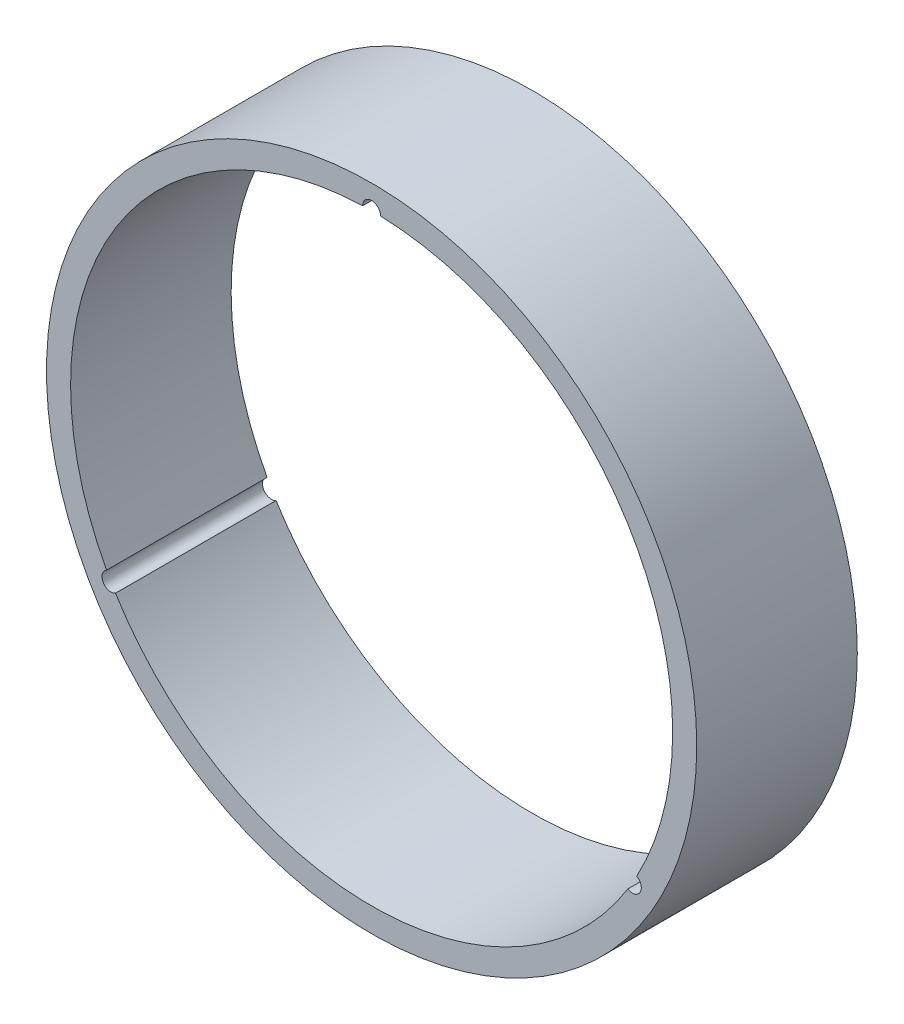
ISO-10303-21;
HEADER;
FILE_DESCRIPTION(('STEP AP214'),'2;1');
FILE_NAME('part.step','',(''),(''),'','','');
FILE_SCHEMA(('AUTOMOTIVE_DESIGN { 1 0 10303 214 1 1 1 1 }'));
ENDSEC;
DATA;
#1=APPLICATION_CONTEXT('core data for automotive mechanical design processes');
#2=APPLICATION_PROTOCOL_DEFINITION('international standard','automotive_design',2000,#1);
#3=PRODUCT_CONTEXT('',#1,'mechanical');
#4=PRODUCT('Part','Part','',(#3));
#5=PRODUCT_RELATED_PRODUCT_CATEGORY('part','',(#4));
#6=PRODUCT_DEFINITION_FORMATION('','',#4);
#7=PRODUCT_DEFINITION_CONTEXT('part definition',#1,'design');
#8=PRODUCT_DEFINITION('design','',#6,#7);
#9=PRODUCT_DEFINITION_SHAPE('','',#8);
#10=(LENGTH_UNIT() NAMED_UNIT(*) SI_UNIT(.MILLI.,.METRE.));
#11=(NAMED_UNIT(*) PLANE_ANGLE_UNIT() SI_UNIT($,.RADIAN.));
#12=(NAMED_UNIT(*) SI_UNIT($,.STERADIAN.) SOLID_ANGLE_UNIT());
#13=UNCERTAINTY_MEASURE_WITH_UNIT(LENGTH_MEASURE(1.E-05),#10,'distance_accuracy_value','');
#14=(GEOMETRIC_REPRESENTATION_CONTEXT(3) GLOBAL_UNCERTAINTY_ASSIGNED_CONTEXT((#13)) GLOBAL_UNIT_ASSIGNED_CONTEXT((#10,
#11,#12)) REPRESENTATION_CONTEXT('',''));
#15=CARTESIAN_POINT('',(0.,0.,0.));
#16=DIRECTION('',(0.,0.,1.));
#17=DIRECTION('',(1.,0.,0.));
#18=AXIS2_PLACEMENT_3D('',#15,#16,#17);
#19=CARTESIAN_POINT('',(-64.951905283833,-37.5000000000051,40.));
#20=DIRECTION('',(0.,0.,-1.));
#21=DIRECTION('',(-1.,0.,0.));
#22=AXIS2_PLACEMENT_3D('',#19,#20,#21);
#23=CYLINDRICAL_SURFACE('',#22,2.23193691646725);
#24=CARTESIAN_POINT('',(-64.951905283833,-37.5000000000051,0.));
#25=DIRECTION('',(0.,0.,1.));
#26=DIRECTION('',(1.,0.,0.));
#27=AXIS2_PLACEMENT_3D('',#24,#25,#26);
#28=CIRCLE('',#27,2.23193691646725);
#29=CARTESIAN_POINT('',(-66.038989248015,-35.5506947766222,0.));
#30=VERTEX_POINT('',#29);
#31=CARTESIAN_POINT('',(-63.8072994227445,-39.4160949407247,0.));
#32=VERTEX_POINT('',#31);
#33=EDGE_CURVE('E120',#30,#32,#28,.T.);
#34=ORIENTED_EDGE('',*,*,#33,.F.);
#35=DIRECTION('',(0.,0.,-1.));
#36=VECTOR('',#35,1.);
#37=CARTESIAN_POINT('',(-66.038989248015,-35.5506947766222,40.));
#38=LINE('',#37,#36);
#39=CARTESIAN_POINT('',(-66.038989248015,-35.5506947766222,40.));
#40=VERTEX_POINT('',#39);
#41=EDGE_CURVE('E11',#40,#30,#38,.T.);
#42=ORIENTED_EDGE('',*,*,#41,.F.);
#43=CARTESIAN_POINT('',(-64.951905283833,-37.5000000000051,40.));
#44=DIRECTION('',(0.,0.,1.));
#45=DIRECTION('',(1.,0.,0.));
#46=AXIS2_PLACEMENT_3D('',#43,#44,#45);
#47=CIRCLE('',#46,2.23193691646725);
#48=CARTESIAN_POINT('',(-63.8072994227445,-39.4160949407247,40.));
#49=VERTEX_POINT('',#48);
#50=EDGE_CURVE('E134',#40,#49,#47,.T.);
#51=ORIENTED_EDGE('',*,*,#50,.T.);
#52=DIRECTION('',(0.,0.,-1.));
#53=VECTOR('',#52,1.);
#54=CARTESIAN_POINT('',(-63.8072994227445,-39.4160949407247,40.));
#55=LINE('',#54,#53);
#56=EDGE_CURVE('E51',#49,#32,#55,.T.);
#57=ORIENTED_EDGE('',*,*,#56,.T.);
#58=EDGE_LOOP('',(#34,#42,#51,#57));
#59=FACE_BOUND('',#58,.T.);
#60=ADVANCED_FACE('F35',(#59),#23,.F.);
#61=CARTESIAN_POINT('',(0.,0.,40.));
#62=DIRECTION('',(0.,0.,-1.));
#63=DIRECTION('',(-1.,0.,0.));
#64=AXIS2_PLACEMENT_3D('',#61,#62,#63);
#65=CYLINDRICAL_SURFACE('',#64,75.);
#66=CARTESIAN_POINT('',(0.,0.,0.));
#67=DIRECTION('',(0.,0.,1.));
#68=DIRECTION('',(1.,0.,0.));
#69=AXIS2_PLACEMENT_3D('',#66,#67,#68);
#70=CIRCLE('',#69,75.);
#71=CARTESIAN_POINT('',(-2.23168982527002,74.9667897173394,0.));
#72=VERTEX_POINT('',#71);
#73=EDGE_CURVE('E122',#72,#30,#70,.T.);
#74=ORIENTED_EDGE('',*,*,#73,.F.);
#75=DIRECTION('',(0.,0.,-1.));
#76=VECTOR('',#75,1.);
#77=CARTESIAN_POINT('',(-2.23168982527002,74.9667897173394,40.));
#78=LINE('',#77,#76);
#79=CARTESIAN_POINT('',(-2.23168982527002,74.9667897173394,40.));
#80=VERTEX_POINT('',#79);
#81=EDGE_CURVE('E43',#80,#72,#78,.T.);
#82=ORIENTED_EDGE('',*,*,#81,.F.);
#83=CARTESIAN_POINT('',(0.,0.,40.));
#84=DIRECTION('',(0.,0.,1.));
#85=DIRECTION('',(1.,0.,0.));
#86=AXIS2_PLACEMENT_3D('',#83,#84,#85);
#87=CIRCLE('',#86,75.);
#88=EDGE_CURVE('E111',#80,#40,#87,.T.);
#89=ORIENTED_EDGE('',*,*,#88,.T.);
#90=ORIENTED_EDGE('',*,*,#41,.T.);
#91=EDGE_LOOP('',(#74,#82,#89,#90));
#92=FACE_BOUND('',#91,.T.);
#93=ADVANCED_FACE('F143',(#92),#65,.F.);
#94=CARTESIAN_POINT('',(2.61861100413235E-13,75.,40.));
#95=DIRECTION('',(0.,0.,-1.));
#96=DIRECTION('',(-1.,0.,0.));
#97=AXIS2_PLACEMENT_3D('',#94,#95,#96);
#98=CYLINDRICAL_SURFACE('',#97,2.23193691646725);
#99=CARTESIAN_POINT('',(2.61861100413235E-13,75.,0.));
#100=DIRECTION('',(0.,0.,1.));
#101=DIRECTION('',(1.,0.,0.));
#102=AXIS2_PLACEMENT_3D('',#99,#100,#101);
#103=CIRCLE('',#102,2.23193691646725);
#104=CARTESIAN_POINT('',(2.23168982527054,74.9667897173394,0.));
#105=VERTEX_POINT('',#104);
#106=EDGE_CURVE('E125',#105,#72,#103,.T.);
#107=ORIENTED_EDGE('',*,*,#106,.F.);
#108=DIRECTION('',(0.,0.,-1.));
#109=VECTOR('',#108,1.);
#110=CARTESIAN_POINT('',(2.23168982527054,74.9667897173394,40.));
#111=LINE('',#110,#109);
#112=CARTESIAN_POINT('',(2.23168982527054,74.9667897173394,40.));
#113=VERTEX_POINT('',#112);
#114=EDGE_CURVE('E98',#113,#105,#111,.T.);
#115=ORIENTED_EDGE('',*,*,#114,.F.);
#116=CARTESIAN_POINT('',(2.61861100413235E-13,75.,40.));
#117=DIRECTION('',(0.,0.,1.));
#118=DIRECTION('',(1.,0.,0.));
#119=AXIS2_PLACEMENT_3D('',#116,#117,#118);
#120=CIRCLE('',#119,2.23193691646725);
#121=EDGE_CURVE('E109',#113,#80,#120,.T.);
#122=ORIENTED_EDGE('',*,*,#121,.T.);
#123=ORIENTED_EDGE('',*,*,#81,.T.);
#124=EDGE_LOOP('',(#107,#115,#122,#123));
#125=FACE_BOUND('',#124,.T.);
#126=ADVANCED_FACE('F140',(#125),#98,.F.);
#127=CARTESIAN_POINT('',(66.038989248017,-35.5506947766186,0.));
#128=VERTEX_POINT('',#127);
#129=EDGE_CURVE('E94',#128,#105,#70,.T.);
#130=ORIENTED_EDGE('',*,*,#129,.F.);
#131=DIRECTION('',(0.,0.,-1.));
#132=VECTOR('',#131,1.);
#133=CARTESIAN_POINT('',(66.038989248017,-35.5506947766186,40.));
#134=LINE('',#133,#132);
#135=CARTESIAN_POINT('',(66.038989248017,-35.5506947766186,40.));
#136=VERTEX_POINT('',#135);
#137=EDGE_CURVE('E89',#136,#128,#134,.T.);
#138=ORIENTED_EDGE('',*,*,#137,.F.);
#139=EDGE_CURVE('E92',#136,#113,#87,.T.);
#140=ORIENTED_EDGE('',*,*,#139,.T.);
#141=ORIENTED_EDGE('',*,*,#114,.T.);
#142=EDGE_LOOP('',(#130,#138,#140,#141));
#143=FACE_BOUND('',#142,.T.);
#144=ADVANCED_FACE('F91',(#143),#65,.F.);
#145=CARTESIAN_POINT('',(64.9519052838374,-37.5000000000028,40.));
#146=DIRECTION('',(0.,0.,-1.));
#147=DIRECTION('',(-1.,0.,0.));
#148=AXIS2_PLACEMENT_3D('',#145,#146,#147);
#149=CYLINDRICAL_SURFACE('',#148,2.23193691646727);
#150=CARTESIAN_POINT('',(64.9519052838374,-37.5000000000028,0.));
#151=DIRECTION('',(0.,0.,1.));
#152=DIRECTION('',(1.,0.,0.));
#153=AXIS2_PLACEMENT_3D('',#150,#151,#152);
#154=CIRCLE('',#153,2.23193691646727);
#155=CARTESIAN_POINT('',(63.8072994227467,-39.4160949407212,0.));
#156=VERTEX_POINT('',#155);
#157=EDGE_CURVE('E129',#156,#128,#154,.T.);
#158=ORIENTED_EDGE('',*,*,#157,.F.);
#159=DIRECTION('',(0.,0.,-1.));
#160=VECTOR('',#159,1.);
#161=CARTESIAN_POINT('',(63.8072994227467,-39.4160949407212,40.));
#162=LINE('',#161,#160);
#163=CARTESIAN_POINT('',(63.8072994227467,-39.4160949407212,40.));
#164=VERTEX_POINT('',#163);
#165=EDGE_CURVE('E70',#164,#156,#162,.T.);
#166=ORIENTED_EDGE('',*,*,#165,.F.);
#167=CARTESIAN_POINT('',(64.9519052838374,-37.5000000000028,40.));
#168=DIRECTION('',(0.,0.,1.));
#169=DIRECTION('',(1.,0.,0.));
#170=AXIS2_PLACEMENT_3D('',#167,#168,#169);
#171=CIRCLE('',#170,2.23193691646727);
#172=EDGE_CURVE('E106',#164,#136,#171,.T.);
#173=ORIENTED_EDGE('',*,*,#172,.T.);
#174=ORIENTED_EDGE('',*,*,#137,.T.);
#175=EDGE_LOOP('',(#158,#166,#173,#174));
#176=FACE_BOUND('',#175,.T.);
#177=ADVANCED_FACE('F113',(#176),#149,.F.);
#178=EDGE_CURVE('E126',#32,#156,#70,.T.);
#179=ORIENTED_EDGE('',*,*,#178,.F.);
#180=ORIENTED_EDGE('',*,*,#56,.F.);
#181=EDGE_CURVE('E112',#49,#164,#87,.T.);
#182=ORIENTED_EDGE('',*,*,#181,.T.);
#183=ORIENTED_EDGE('',*,*,#165,.T.);
#184=EDGE_LOOP('',(#179,#180,#182,#183));
#185=FACE_BOUND('',#184,.T.);
#186=ADVANCED_FACE('F148',(#185),#65,.F.);
#187=CARTESIAN_POINT('',(0.,0.,40.));
#188=DIRECTION('',(0.,0.,-1.));
#189=DIRECTION('',(-1.,0.,0.));
#190=AXIS2_PLACEMENT_3D('',#187,#188,#189);
#191=CYLINDRICAL_SURFACE('',#190,81.);
#192=CARTESIAN_POINT('',(0.,0.,40.));
#193=DIRECTION('',(0.,0.,1.));
#194=DIRECTION('',(1.,0.,0.));
#195=AXIS2_PLACEMENT_3D('',#192,#193,#194);
#196=CIRCLE('',#195,81.);
#197=CARTESIAN_POINT('',(81.,0.,40.));
#198=VERTEX_POINT('',#197);
#199=EDGE_CURVE('E115',#198,#198,#196,.T.);
#200=ORIENTED_EDGE('',*,*,#199,.F.);
#201=EDGE_LOOP('',(#200));
#202=FACE_BOUND('',#201,.T.);
#203=CARTESIAN_POINT('',(0.,0.,0.));
#204=DIRECTION('',(0.,0.,1.));
#205=DIRECTION('',(1.,0.,0.));
#206=AXIS2_PLACEMENT_3D('',#203,#204,#205);
#207=CIRCLE('',#206,81.);
#208=CARTESIAN_POINT('',(81.,0.,0.));
#209=VERTEX_POINT('',#208);
#210=EDGE_CURVE('E131',#209,#209,#207,.T.);
#211=ORIENTED_EDGE('',*,*,#210,.T.);
#212=EDGE_LOOP('',(#211));
#213=FACE_BOUND('',#212,.T.);
#214=ADVANCED_FACE('F150',(#202,#213),#191,.T.);
#215=CARTESIAN_POINT('',(0.,0.,40.));
#216=DIRECTION('',(0.,0.,1.));
#217=DIRECTION('',(1.,0.,0.));
#218=AXIS2_PLACEMENT_3D('',#215,#216,#217);
#219=PLANE('',#218);
#220=ORIENTED_EDGE('',*,*,#50,.F.);
#221=ORIENTED_EDGE('',*,*,#88,.F.);
#222=ORIENTED_EDGE('',*,*,#121,.F.);
#223=ORIENTED_EDGE('',*,*,#139,.F.);
#224=ORIENTED_EDGE('',*,*,#172,.F.);
#225=ORIENTED_EDGE('',*,*,#181,.F.);
#226=EDGE_LOOP('',(#220,#221,#222,#223,#224,#225));
#227=FACE_BOUND('',#226,.T.);
#228=ORIENTED_EDGE('',*,*,#199,.T.);
#229=EDGE_LOOP('',(#228));
#230=FACE_BOUND('',#229,.T.);
#231=ADVANCED_FACE('F103',(#227,#230),#219,.T.);
#232=CARTESIAN_POINT('',(0.,0.,0.));
#233=DIRECTION('',(0.,0.,1.));
#234=DIRECTION('',(1.,0.,0.));
#235=AXIS2_PLACEMENT_3D('',#232,#233,#234);
#236=PLANE('',#235);
#237=ORIENTED_EDGE('',*,*,#33,.T.);
#238=ORIENTED_EDGE('',*,*,#178,.T.);
#239=ORIENTED_EDGE('',*,*,#157,.T.);
#240=ORIENTED_EDGE('',*,*,#129,.T.);
#241=ORIENTED_EDGE('',*,*,#106,.T.);
#242=ORIENTED_EDGE('',*,*,#73,.T.);
#243=EDGE_LOOP('',(#237,#238,#239,#240,#241,#242));
#244=FACE_BOUND('',#243,.T.);
#245=ORIENTED_EDGE('',*,*,#210,.F.);
#246=EDGE_LOOP('',(#245));
#247=FACE_BOUND('',#246,.T.);
#248=ADVANCED_FACE('F145',(#244,#247),#236,.F.);
#249=CLOSED_SHELL('',(#60,#93,#126,#144,#177,#186,#214,#231,#248));
#250=MANIFOLD_SOLID_BREP('B2',#249);
#251=ADVANCED_BREP_SHAPE_REPRESENTATION('',(#18,#250),#14);
#252=SHAPE_DEFINITION_REPRESENTATION(#9,#251);
ENDSEC;
END-ISO-10303-21;
